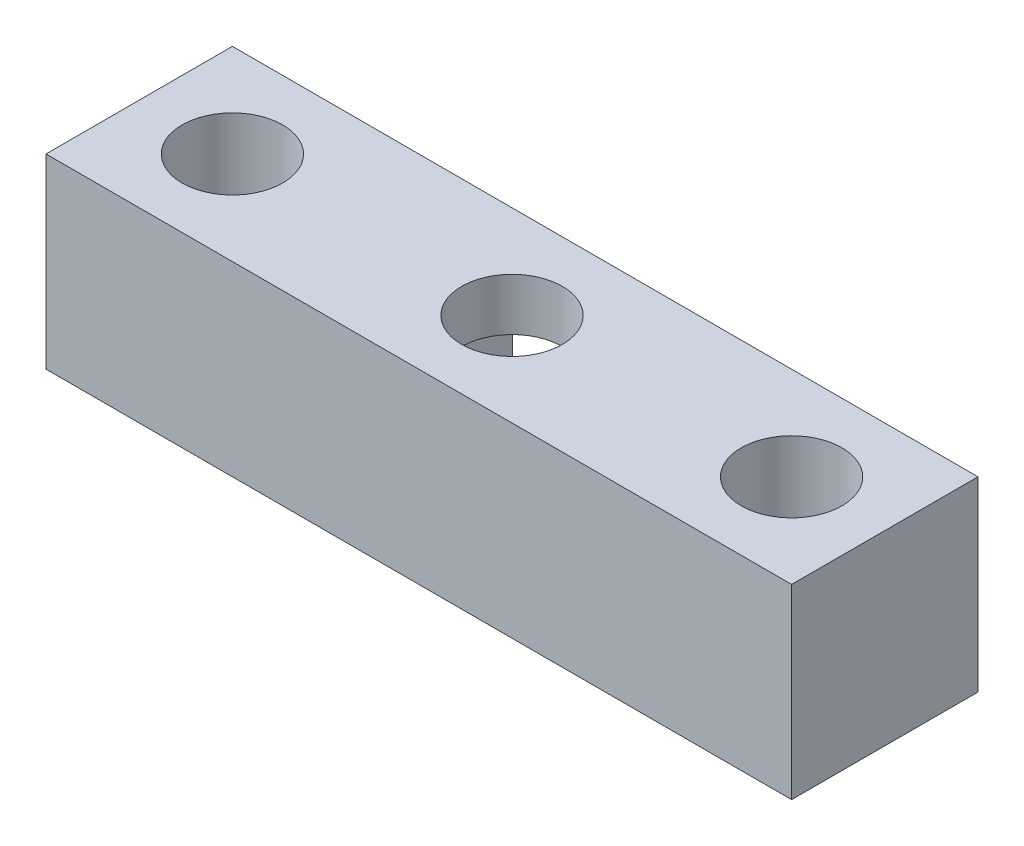
ISO-10303-21;
HEADER;
FILE_DESCRIPTION(('STEP AP214'),'2;1');
FILE_NAME('part.step','',(''),(''),'','','');
FILE_SCHEMA(('AUTOMOTIVE_DESIGN { 1 0 10303 214 1 1 1 1 }'));
ENDSEC;
DATA;
#1=APPLICATION_CONTEXT('core data for automotive mechanical design processes');
#2=APPLICATION_PROTOCOL_DEFINITION('international standard','automotive_design',2000,#1);
#3=PRODUCT_CONTEXT('',#1,'mechanical');
#4=PRODUCT('Part','Part','',(#3));
#5=PRODUCT_RELATED_PRODUCT_CATEGORY('part','',(#4));
#6=PRODUCT_DEFINITION_FORMATION('','',#4);
#7=PRODUCT_DEFINITION_CONTEXT('part definition',#1,'design');
#8=PRODUCT_DEFINITION('design','',#6,#7);
#9=PRODUCT_DEFINITION_SHAPE('','',#8);
#10=(LENGTH_UNIT() NAMED_UNIT(*) SI_UNIT(.MILLI.,.METRE.));
#11=(NAMED_UNIT(*) PLANE_ANGLE_UNIT() SI_UNIT($,.RADIAN.));
#12=(NAMED_UNIT(*) SI_UNIT($,.STERADIAN.) SOLID_ANGLE_UNIT());
#13=UNCERTAINTY_MEASURE_WITH_UNIT(LENGTH_MEASURE(1.E-05),#10,'distance_accuracy_value','');
#14=(GEOMETRIC_REPRESENTATION_CONTEXT(3) GLOBAL_UNCERTAINTY_ASSIGNED_CONTEXT((#13)) GLOBAL_UNIT_ASSIGNED_CONTEXT((#10,
#11,#12)) REPRESENTATION_CONTEXT('',''));
#15=CARTESIAN_POINT('',(0.,0.,0.));
#16=DIRECTION('',(0.,0.,1.));
#17=DIRECTION('',(1.,0.,0.));
#18=AXIS2_PLACEMENT_3D('',#15,#16,#17);
#19=CARTESIAN_POINT('',(-25.4,12.7,-12.7));
#20=DIRECTION('',(0.,0.,1.));
#21=DIRECTION('',(1.,0.,0.));
#22=AXIS2_PLACEMENT_3D('',#19,#20,#21);
#23=PLANE('',#22);
#24=DIRECTION('',(-1.,0.,0.));
#25=VECTOR('',#24,1.);
#26=CARTESIAN_POINT('',(-25.4,0.,-12.7));
#27=LINE('',#26,#25);
#28=CARTESIAN_POINT('',(25.4,0.,-12.7));
#29=VERTEX_POINT('',#28);
#30=CARTESIAN_POINT('',(-25.4,0.,-12.7));
#31=VERTEX_POINT('',#30);
#32=EDGE_CURVE('E79',#29,#31,#27,.T.);
#33=ORIENTED_EDGE('',*,*,#32,.T.);
#34=DIRECTION('',(0.,-1.,0.));
#35=VECTOR('',#34,1.);
#36=CARTESIAN_POINT('',(-25.4,12.7,-12.7));
#37=LINE('',#36,#35);
#38=CARTESIAN_POINT('',(-25.4,12.7,-12.7));
#39=VERTEX_POINT('',#38);
#40=EDGE_CURVE('E199',#39,#31,#37,.T.);
#41=ORIENTED_EDGE('',*,*,#40,.F.);
#42=DIRECTION('',(-1.,0.,0.));
#43=VECTOR('',#42,1.);
#44=CARTESIAN_POINT('',(-25.4,12.7,-12.7));
#45=LINE('',#44,#43);
#46=CARTESIAN_POINT('',(25.4,12.7,-12.7));
#47=VERTEX_POINT('',#46);
#48=EDGE_CURVE('E58',#47,#39,#45,.T.);
#49=ORIENTED_EDGE('',*,*,#48,.F.);
#50=DIRECTION('',(0.,-1.,0.));
#51=VECTOR('',#50,1.);
#52=CARTESIAN_POINT('',(25.4,12.7,-12.7));
#53=LINE('',#52,#51);
#54=EDGE_CURVE('E208',#47,#29,#53,.T.);
#55=ORIENTED_EDGE('',*,*,#54,.T.);
#56=EDGE_LOOP('',(#33,#41,#49,#55));
#57=FACE_BOUND('',#56,.T.);
#58=DIRECTION('',(-1.,0.,0.));
#59=VECTOR('',#58,1.);
#60=CARTESIAN_POINT('',(-25.4,3.556,-12.7));
#61=LINE('',#60,#59);
#62=CARTESIAN_POINT('',(6.30581964008909,3.556,-12.7));
#63=VERTEX_POINT('',#62);
#64=CARTESIAN_POINT('',(-6.30581964008909,3.556,-12.7));
#65=VERTEX_POINT('',#64);
#66=EDGE_CURVE('E172',#63,#65,#61,.T.);
#67=ORIENTED_EDGE('',*,*,#66,.F.);
#68=DIRECTION('',(0.,1.,0.));
#69=VECTOR('',#68,1.);
#70=CARTESIAN_POINT('',(6.30581964008909,12.7,-12.7));
#71=LINE('',#70,#69);
#72=CARTESIAN_POINT('',(6.30581964008909,9.144,-12.7));
#73=VERTEX_POINT('',#72);
#74=EDGE_CURVE('E42',#63,#73,#71,.T.);
#75=ORIENTED_EDGE('',*,*,#74,.T.);
#76=DIRECTION('',(-1.,0.,0.));
#77=VECTOR('',#76,1.);
#78=CARTESIAN_POINT('',(-25.4,9.144,-12.7));
#79=LINE('',#78,#77);
#80=CARTESIAN_POINT('',(-6.30581964008909,9.144,-12.7));
#81=VERTEX_POINT('',#80);
#82=EDGE_CURVE('E168',#73,#81,#79,.T.);
#83=ORIENTED_EDGE('',*,*,#82,.T.);
#84=DIRECTION('',(0.,-1.,0.));
#85=VECTOR('',#84,1.);
#86=CARTESIAN_POINT('',(-6.30581964008909,12.7,-12.7));
#87=LINE('',#86,#85);
#88=EDGE_CURVE('E11',#81,#65,#87,.T.);
#89=ORIENTED_EDGE('',*,*,#88,.T.);
#90=EDGE_LOOP('',(#67,#75,#83,#89));
#91=FACE_BOUND('',#90,.T.);
#92=ADVANCED_FACE('F34',(#57,#91),#23,.F.);
#93=CARTESIAN_POINT('',(0.,0.,-6.34999999999999));
#94=DIRECTION('',(0.,1.,0.));
#95=DIRECTION('',(0.,0.,1.));
#96=AXIS2_PLACEMENT_3D('',#93,#94,#95);
#97=CYLINDRICAL_SURFACE('',#96,3.429);
#98=CARTESIAN_POINT('',(0.,0.,-6.34999999999999));
#99=DIRECTION('',(0.,1.,0.));
#100=DIRECTION('',(0.,0.,1.));
#101=AXIS2_PLACEMENT_3D('',#98,#99,#100);
#102=CIRCLE('',#101,3.429);
#103=CARTESIAN_POINT('',(0.,0.,-2.92099999999999));
#104=VERTEX_POINT('',#103);
#105=EDGE_CURVE('E182',#104,#104,#102,.T.);
#106=ORIENTED_EDGE('',*,*,#105,.F.);
#107=EDGE_LOOP('',(#106));
#108=FACE_BOUND('',#107,.T.);
#109=CARTESIAN_POINT('',(0.,3.556,-6.34999999999999));
#110=DIRECTION('',(0.,1.,0.));
#111=DIRECTION('',(0.,0.,1.));
#112=AXIS2_PLACEMENT_3D('',#109,#110,#111);
#113=CIRCLE('',#112,3.429);
#114=CARTESIAN_POINT('',(0.,3.556,-2.92099999999999));
#115=VERTEX_POINT('',#114);
#116=EDGE_CURVE('E171',#115,#115,#113,.F.);
#117=ORIENTED_EDGE('',*,*,#116,.F.);
#118=EDGE_LOOP('',(#117));
#119=FACE_BOUND('',#118,.T.);
#120=ADVANCED_FACE('F242',(#108,#119),#97,.F.);
#121=CARTESIAN_POINT('',(-25.4,12.7,-12.7));
#122=DIRECTION('',(1.,0.,0.));
#123=DIRECTION('',(0.,0.,-1.));
#124=AXIS2_PLACEMENT_3D('',#121,#122,#123);
#125=PLANE('',#124);
#126=DIRECTION('',(0.,0.,1.));
#127=VECTOR('',#126,1.);
#128=CARTESIAN_POINT('',(-25.4,0.,-12.7));
#129=LINE('',#128,#127);
#130=CARTESIAN_POINT('',(-25.4,0.,0.));
#131=VERTEX_POINT('',#130);
#132=EDGE_CURVE('E190',#31,#131,#129,.T.);
#133=ORIENTED_EDGE('',*,*,#132,.T.);
#134=DIRECTION('',(0.,-1.,0.));
#135=VECTOR('',#134,1.);
#136=CARTESIAN_POINT('',(-25.4,12.7,0.));
#137=LINE('',#136,#135);
#138=CARTESIAN_POINT('',(-25.4,12.7,0.));
#139=VERTEX_POINT('',#138);
#140=EDGE_CURVE('E213',#139,#131,#137,.T.);
#141=ORIENTED_EDGE('',*,*,#140,.F.);
#142=DIRECTION('',(0.,0.,1.));
#143=VECTOR('',#142,1.);
#144=CARTESIAN_POINT('',(-25.4,12.7,-12.7));
#145=LINE('',#144,#143);
#146=EDGE_CURVE('E193',#39,#139,#145,.T.);
#147=ORIENTED_EDGE('',*,*,#146,.F.);
#148=ORIENTED_EDGE('',*,*,#40,.T.);
#149=EDGE_LOOP('',(#133,#141,#147,#148));
#150=FACE_BOUND('',#149,.T.);
#151=ADVANCED_FACE('F36',(#150),#125,.F.);
#152=CARTESIAN_POINT('',(-25.4,12.7,0.));
#153=DIRECTION('',(0.,0.,-1.));
#154=DIRECTION('',(-1.,0.,0.));
#155=AXIS2_PLACEMENT_3D('',#152,#153,#154);
#156=PLANE('',#155);
#157=DIRECTION('',(1.,0.,0.));
#158=VECTOR('',#157,1.);
#159=CARTESIAN_POINT('',(-25.4,0.,0.));
#160=LINE('',#159,#158);
#161=CARTESIAN_POINT('',(25.4,0.,0.));
#162=VERTEX_POINT('',#161);
#163=EDGE_CURVE('E202',#131,#162,#160,.T.);
#164=ORIENTED_EDGE('',*,*,#163,.T.);
#165=DIRECTION('',(0.,-1.,0.));
#166=VECTOR('',#165,1.);
#167=CARTESIAN_POINT('',(25.4,12.7,0.));
#168=LINE('',#167,#166);
#169=CARTESIAN_POINT('',(25.4,12.7,0.));
#170=VERTEX_POINT('',#169);
#171=EDGE_CURVE('E210',#170,#162,#168,.T.);
#172=ORIENTED_EDGE('',*,*,#171,.F.);
#173=DIRECTION('',(1.,0.,0.));
#174=VECTOR('',#173,1.);
#175=CARTESIAN_POINT('',(-25.4,12.7,0.));
#176=LINE('',#175,#174);
#177=EDGE_CURVE('E87',#139,#170,#176,.T.);
#178=ORIENTED_EDGE('',*,*,#177,.F.);
#179=ORIENTED_EDGE('',*,*,#140,.T.);
#180=EDGE_LOOP('',(#164,#172,#178,#179));
#181=FACE_BOUND('',#180,.T.);
#182=ADVANCED_FACE('F257',(#181),#156,.F.);
#183=CARTESIAN_POINT('',(25.4,12.7,-12.7));
#184=DIRECTION('',(-1.,0.,0.));
#185=DIRECTION('',(0.,0.,1.));
#186=AXIS2_PLACEMENT_3D('',#183,#184,#185);
#187=PLANE('',#186);
#188=DIRECTION('',(0.,0.,-1.));
#189=VECTOR('',#188,1.);
#190=CARTESIAN_POINT('',(25.4,0.,-12.7));
#191=LINE('',#190,#189);
#192=EDGE_CURVE('E204',#162,#29,#191,.T.);
#193=ORIENTED_EDGE('',*,*,#192,.T.);
#194=ORIENTED_EDGE('',*,*,#54,.F.);
#195=DIRECTION('',(0.,0.,-1.));
#196=VECTOR('',#195,1.);
#197=CARTESIAN_POINT('',(25.4,12.7,-12.7));
#198=LINE('',#197,#196);
#199=EDGE_CURVE('E196',#170,#47,#198,.T.);
#200=ORIENTED_EDGE('',*,*,#199,.F.);
#201=ORIENTED_EDGE('',*,*,#171,.T.);
#202=EDGE_LOOP('',(#193,#194,#200,#201));
#203=FACE_BOUND('',#202,.T.);
#204=ADVANCED_FACE('F254',(#203),#187,.F.);
#205=CARTESIAN_POINT('',(0.,12.7,0.));
#206=DIRECTION('',(0.,1.,0.));
#207=DIRECTION('',(0.,0.,1.));
#208=AXIS2_PLACEMENT_3D('',#205,#206,#207);
#209=PLANE('',#208);
#210=CARTESIAN_POINT('',(19.05,12.7,-6.34999999999999));
#211=DIRECTION('',(0.,1.,0.));
#212=DIRECTION('',(0.,0.,1.));
#213=AXIS2_PLACEMENT_3D('',#210,#211,#212);
#214=CIRCLE('',#213,3.429);
#215=CARTESIAN_POINT('',(19.05,12.7,-2.92099999999999));
#216=VERTEX_POINT('',#215);
#217=EDGE_CURVE('E179',#216,#216,#214,.T.);
#218=ORIENTED_EDGE('',*,*,#217,.F.);
#219=EDGE_LOOP('',(#218));
#220=FACE_BOUND('',#219,.T.);
#221=CARTESIAN_POINT('',(0.,12.7,-6.34999999999999));
#222=DIRECTION('',(0.,1.,0.));
#223=DIRECTION('',(0.,0.,1.));
#224=AXIS2_PLACEMENT_3D('',#221,#222,#223);
#225=CIRCLE('',#224,3.429);
#226=CARTESIAN_POINT('',(0.,12.7,-2.92099999999999));
#227=VERTEX_POINT('',#226);
#228=EDGE_CURVE('E174',#227,#227,#225,.T.);
#229=ORIENTED_EDGE('',*,*,#228,.F.);
#230=EDGE_LOOP('',(#229));
#231=FACE_BOUND('',#230,.T.);
#232=CARTESIAN_POINT('',(-19.05,12.7,-6.34999999999999));
#233=DIRECTION('',(0.,1.,0.));
#234=DIRECTION('',(0.,0.,1.));
#235=AXIS2_PLACEMENT_3D('',#232,#233,#234);
#236=CIRCLE('',#235,3.429);
#237=CARTESIAN_POINT('',(-19.05,12.7,-2.92099999999999));
#238=VERTEX_POINT('',#237);
#239=EDGE_CURVE('E178',#238,#238,#236,.T.);
#240=ORIENTED_EDGE('',*,*,#239,.F.);
#241=EDGE_LOOP('',(#240));
#242=FACE_BOUND('',#241,.T.);
#243=ORIENTED_EDGE('',*,*,#146,.T.);
#244=ORIENTED_EDGE('',*,*,#177,.T.);
#245=ORIENTED_EDGE('',*,*,#199,.T.);
#246=ORIENTED_EDGE('',*,*,#48,.T.);
#247=EDGE_LOOP('',(#243,#244,#245,#246));
#248=FACE_BOUND('',#247,.T.);
#249=ADVANCED_FACE('F256',(#220,#231,#242,#248),#209,.T.);
#250=CARTESIAN_POINT('',(0.,0.,0.));
#251=DIRECTION('',(0.,1.,0.));
#252=DIRECTION('',(0.,0.,1.));
#253=AXIS2_PLACEMENT_3D('',#250,#251,#252);
#254=PLANE('',#253);
#255=CARTESIAN_POINT('',(19.05,0.,-6.34999999999999));
#256=DIRECTION('',(0.,1.,0.));
#257=DIRECTION('',(0.,0.,1.));
#258=AXIS2_PLACEMENT_3D('',#255,#256,#257);
#259=CIRCLE('',#258,3.429);
#260=CARTESIAN_POINT('',(19.05,0.,-2.92099999999999));
#261=VERTEX_POINT('',#260);
#262=EDGE_CURVE('E175',#261,#261,#259,.T.);
#263=ORIENTED_EDGE('',*,*,#262,.T.);
#264=EDGE_LOOP('',(#263));
#265=FACE_BOUND('',#264,.T.);
#266=ORIENTED_EDGE('',*,*,#105,.T.);
#267=EDGE_LOOP('',(#266));
#268=FACE_BOUND('',#267,.T.);
#269=CARTESIAN_POINT('',(-19.05,0.,-6.34999999999999));
#270=DIRECTION('',(0.,1.,0.));
#271=DIRECTION('',(0.,0.,1.));
#272=AXIS2_PLACEMENT_3D('',#269,#270,#271);
#273=CIRCLE('',#272,3.429);
#274=CARTESIAN_POINT('',(-19.05,0.,-2.92099999999999));
#275=VERTEX_POINT('',#274);
#276=EDGE_CURVE('E187',#275,#275,#273,.T.);
#277=ORIENTED_EDGE('',*,*,#276,.T.);
#278=EDGE_LOOP('',(#277));
#279=FACE_BOUND('',#278,.T.);
#280=ORIENTED_EDGE('',*,*,#132,.F.);
#281=ORIENTED_EDGE('',*,*,#32,.F.);
#282=ORIENTED_EDGE('',*,*,#192,.F.);
#283=ORIENTED_EDGE('',*,*,#163,.F.);
#284=EDGE_LOOP('',(#280,#281,#282,#283));
#285=FACE_BOUND('',#284,.T.);
#286=ADVANCED_FACE('F252',(#265,#268,#279,#285),#254,.F.);
#287=CARTESIAN_POINT('',(-19.05,0.,-6.34999999999999));
#288=DIRECTION('',(0.,1.,0.));
#289=DIRECTION('',(0.,0.,1.));
#290=AXIS2_PLACEMENT_3D('',#287,#288,#289);
#291=CYLINDRICAL_SURFACE('',#290,3.429);
#292=ORIENTED_EDGE('',*,*,#276,.F.);
#293=EDGE_LOOP('',(#292));
#294=FACE_BOUND('',#293,.T.);
#295=ORIENTED_EDGE('',*,*,#239,.T.);
#296=EDGE_LOOP('',(#295));
#297=FACE_BOUND('',#296,.T.);
#298=ADVANCED_FACE('F276',(#294,#297),#291,.F.);
#299=CARTESIAN_POINT('',(0.,9.144,-6.34999999999999));
#300=DIRECTION('',(0.,1.,0.));
#301=DIRECTION('',(0.,0.,1.));
#302=AXIS2_PLACEMENT_3D('',#299,#300,#301);
#303=CIRCLE('',#302,3.429);
#304=CARTESIAN_POINT('',(0.,9.144,-2.92099999999999));
#305=VERTEX_POINT('',#304);
#306=EDGE_CURVE('E164',#305,#305,#303,.F.);
#307=ORIENTED_EDGE('',*,*,#306,.T.);
#308=EDGE_LOOP('',(#307));
#309=FACE_BOUND('',#308,.T.);
#310=ORIENTED_EDGE('',*,*,#228,.T.);
#311=EDGE_LOOP('',(#310));
#312=FACE_BOUND('',#311,.T.);
#313=ADVANCED_FACE('F249',(#309,#312),#97,.F.);
#314=CARTESIAN_POINT('',(19.05,0.,-6.34999999999999));
#315=DIRECTION('',(0.,1.,0.));
#316=DIRECTION('',(0.,0.,1.));
#317=AXIS2_PLACEMENT_3D('',#314,#315,#316);
#318=CYLINDRICAL_SURFACE('',#317,3.429);
#319=ORIENTED_EDGE('',*,*,#262,.F.);
#320=EDGE_LOOP('',(#319));
#321=FACE_BOUND('',#320,.T.);
#322=ORIENTED_EDGE('',*,*,#217,.T.);
#323=EDGE_LOOP('',(#322));
#324=FACE_BOUND('',#323,.T.);
#325=ADVANCED_FACE('F285',(#321,#324),#318,.F.);
#326=CARTESIAN_POINT('',(-6.30581964008909,3.556,-6.34999999999999));
#327=DIRECTION('',(-1.,0.,0.));
#328=DIRECTION('',(0.,0.,1.));
#329=AXIS2_PLACEMENT_3D('',#326,#327,#328);
#330=PLANE('',#329);
#331=DIRECTION('',(0.,0.,1.));
#332=VECTOR('',#331,1.);
#333=CARTESIAN_POINT('',(-6.30581964008909,9.144,-6.34999999999999));
#334=LINE('',#333,#332);
#335=CARTESIAN_POINT('',(-6.30581964008909,9.144,-6.34999999999999));
#336=VERTEX_POINT('',#335);
#337=EDGE_CURVE('E49',#81,#336,#334,.T.);
#338=ORIENTED_EDGE('',*,*,#337,.T.);
#339=DIRECTION('',(0.,1.,0.));
#340=VECTOR('',#339,1.);
#341=CARTESIAN_POINT('',(-6.30581964008909,3.556,-6.34999999999999));
#342=LINE('',#341,#340);
#343=CARTESIAN_POINT('',(-6.30581964008909,3.556,-6.34999999999999));
#344=VERTEX_POINT('',#343);
#345=EDGE_CURVE('E162',#344,#336,#342,.T.);
#346=ORIENTED_EDGE('',*,*,#345,.F.);
#347=DIRECTION('',(0.,0.,1.));
#348=VECTOR('',#347,1.);
#349=CARTESIAN_POINT('',(-6.30581964008909,3.556,-6.34999999999999));
#350=LINE('',#349,#348);
#351=EDGE_CURVE('E132',#65,#344,#350,.T.);
#352=ORIENTED_EDGE('',*,*,#351,.F.);
#353=ORIENTED_EDGE('',*,*,#88,.F.);
#354=EDGE_LOOP('',(#338,#346,#352,#353));
#355=FACE_BOUND('',#354,.T.);
#356=ADVANCED_FACE('F288',(#355),#330,.F.);
#357=CARTESIAN_POINT('',(6.30581964008909,3.556,-19.3961390518567));
#358=DIRECTION('',(1.,0.,0.));
#359=DIRECTION('',(0.,0.,-1.));
#360=AXIS2_PLACEMENT_3D('',#357,#358,#359);
#361=PLANE('',#360);
#362=DIRECTION('',(0.,0.,-1.));
#363=VECTOR('',#362,1.);
#364=CARTESIAN_POINT('',(6.30581964008909,3.556,-19.3961390518567));
#365=LINE('',#364,#363);
#366=CARTESIAN_POINT('',(6.30581964008909,3.556,-6.34999999999999));
#367=VERTEX_POINT('',#366);
#368=EDGE_CURVE('E150',#367,#63,#365,.T.);
#369=ORIENTED_EDGE('',*,*,#368,.F.);
#370=DIRECTION('',(0.,1.,0.));
#371=VECTOR('',#370,1.);
#372=CARTESIAN_POINT('',(6.30581964008909,3.556,-6.34999999999999));
#373=LINE('',#372,#371);
#374=CARTESIAN_POINT('',(6.30581964008909,9.144,-6.34999999999999));
#375=VERTEX_POINT('',#374);
#376=EDGE_CURVE('E165',#367,#375,#373,.T.);
#377=ORIENTED_EDGE('',*,*,#376,.T.);
#378=DIRECTION('',(0.,0.,-1.));
#379=VECTOR('',#378,1.);
#380=CARTESIAN_POINT('',(6.30581964008909,9.144,-19.3961390518567));
#381=LINE('',#380,#379);
#382=EDGE_CURVE('E146',#375,#73,#381,.T.);
#383=ORIENTED_EDGE('',*,*,#382,.T.);
#384=ORIENTED_EDGE('',*,*,#74,.F.);
#385=EDGE_LOOP('',(#369,#377,#383,#384));
#386=FACE_BOUND('',#385,.T.);
#387=ADVANCED_FACE('F223',(#386),#361,.F.);
#388=CARTESIAN_POINT('',(0.,3.556,0.));
#389=DIRECTION('',(0.,1.,0.));
#390=DIRECTION('',(0.,0.,1.));
#391=AXIS2_PLACEMENT_3D('',#388,#389,#390);
#392=PLANE('',#391);
#393=ORIENTED_EDGE('',*,*,#116,.T.);
#394=EDGE_LOOP('',(#393));
#395=FACE_BOUND('',#394,.T.);
#396=ORIENTED_EDGE('',*,*,#66,.T.);
#397=ORIENTED_EDGE('',*,*,#351,.T.);
#398=DIRECTION('',(0.5,0.,0.866025403784439));
#399=VECTOR('',#398,1.);
#400=CARTESIAN_POINT('',(-6.30581964008909,3.556,-6.34999999999999));
#401=LINE('',#400,#399);
#402=CARTESIAN_POINT('',(-3.15290982004455,3.556,-0.888999999999993));
#403=VERTEX_POINT('',#402);
#404=EDGE_CURVE('E126',#344,#403,#401,.T.);
#405=ORIENTED_EDGE('',*,*,#404,.T.);
#406=DIRECTION('',(1.,0.,0.));
#407=VECTOR('',#406,1.);
#408=CARTESIAN_POINT('',(-3.15290982004455,3.556,-0.888999999999993));
#409=LINE('',#408,#407);
#410=CARTESIAN_POINT('',(3.15290982004455,3.556,-0.888999999999993));
#411=VERTEX_POINT('',#410);
#412=EDGE_CURVE('E135',#403,#411,#409,.T.);
#413=ORIENTED_EDGE('',*,*,#412,.T.);
#414=DIRECTION('',(0.5,0.,-0.866025403784439));
#415=VECTOR('',#414,1.);
#416=CARTESIAN_POINT('',(3.15290982004455,3.556,-0.888999999999993));
#417=LINE('',#416,#415);
#418=EDGE_CURVE('E140',#411,#367,#417,.T.);
#419=ORIENTED_EDGE('',*,*,#418,.T.);
#420=ORIENTED_EDGE('',*,*,#368,.T.);
#421=EDGE_LOOP('',(#396,#397,#405,#413,#419,#420));
#422=FACE_BOUND('',#421,.T.);
#423=ADVANCED_FACE('F142',(#395,#422),#392,.T.);
#424=CARTESIAN_POINT('',(0.,9.144,0.));
#425=DIRECTION('',(0.,1.,0.));
#426=DIRECTION('',(0.,0.,1.));
#427=AXIS2_PLACEMENT_3D('',#424,#425,#426);
#428=PLANE('',#427);
#429=ORIENTED_EDGE('',*,*,#306,.F.);
#430=EDGE_LOOP('',(#429));
#431=FACE_BOUND('',#430,.T.);
#432=ORIENTED_EDGE('',*,*,#382,.F.);
#433=DIRECTION('',(0.5,0.,-0.866025403784439));
#434=VECTOR('',#433,1.);
#435=CARTESIAN_POINT('',(3.15290982004455,9.144,-0.888999999999993));
#436=LINE('',#435,#434);
#437=CARTESIAN_POINT('',(3.15290982004455,9.144,-0.888999999999993));
#438=VERTEX_POINT('',#437);
#439=EDGE_CURVE('E157',#438,#375,#436,.T.);
#440=ORIENTED_EDGE('',*,*,#439,.F.);
#441=DIRECTION('',(1.,0.,0.));
#442=VECTOR('',#441,1.);
#443=CARTESIAN_POINT('',(-3.15290982004455,9.144,-0.888999999999993));
#444=LINE('',#443,#442);
#445=CARTESIAN_POINT('',(-3.15290982004455,9.144,-0.888999999999993));
#446=VERTEX_POINT('',#445);
#447=EDGE_CURVE('E155',#446,#438,#444,.T.);
#448=ORIENTED_EDGE('',*,*,#447,.F.);
#449=DIRECTION('',(0.5,0.,0.866025403784439));
#450=VECTOR('',#449,1.);
#451=CARTESIAN_POINT('',(-6.30581964008909,9.144,-6.34999999999999));
#452=LINE('',#451,#450);
#453=EDGE_CURVE('E127',#336,#446,#452,.T.);
#454=ORIENTED_EDGE('',*,*,#453,.F.);
#455=ORIENTED_EDGE('',*,*,#337,.F.);
#456=ORIENTED_EDGE('',*,*,#82,.F.);
#457=EDGE_LOOP('',(#432,#440,#448,#454,#455,#456));
#458=FACE_BOUND('',#457,.T.);
#459=ADVANCED_FACE('F228',(#431,#458),#428,.F.);
#460=CARTESIAN_POINT('',(-6.30581964008909,3.556,-6.34999999999999));
#461=DIRECTION('',(-0.866025403784439,0.,0.5));
#462=DIRECTION('',(0.5,0.,0.866025403784439));
#463=AXIS2_PLACEMENT_3D('',#460,#461,#462);
#464=PLANE('',#463);
#465=ORIENTED_EDGE('',*,*,#453,.T.);
#466=DIRECTION('',(0.,1.,0.));
#467=VECTOR('',#466,1.);
#468=CARTESIAN_POINT('',(-3.15290982004455,3.556,-0.888999999999993));
#469=LINE('',#468,#467);
#470=EDGE_CURVE('E121',#403,#446,#469,.T.);
#471=ORIENTED_EDGE('',*,*,#470,.F.);
#472=ORIENTED_EDGE('',*,*,#404,.F.);
#473=ORIENTED_EDGE('',*,*,#345,.T.);
#474=EDGE_LOOP('',(#465,#471,#472,#473));
#475=FACE_BOUND('',#474,.T.);
#476=ADVANCED_FACE('F123',(#475),#464,.F.);
#477=CARTESIAN_POINT('',(3.15290982004455,3.556,-0.888999999999993));
#478=DIRECTION('',(0.866025403784439,0.,0.5));
#479=DIRECTION('',(0.5,0.,-0.866025403784439));
#480=AXIS2_PLACEMENT_3D('',#477,#478,#479);
#481=PLANE('',#480);
#482=ORIENTED_EDGE('',*,*,#439,.T.);
#483=ORIENTED_EDGE('',*,*,#376,.F.);
#484=ORIENTED_EDGE('',*,*,#418,.F.);
#485=DIRECTION('',(0.,1.,0.));
#486=VECTOR('',#485,1.);
#487=CARTESIAN_POINT('',(3.15290982004455,3.556,-0.888999999999993));
#488=LINE('',#487,#486);
#489=EDGE_CURVE('E131',#411,#438,#488,.T.);
#490=ORIENTED_EDGE('',*,*,#489,.T.);
#491=EDGE_LOOP('',(#482,#483,#484,#490));
#492=FACE_BOUND('',#491,.T.);
#493=ADVANCED_FACE('F226',(#492),#481,.F.);
#494=CARTESIAN_POINT('',(-3.15290982004455,3.556,-0.888999999999993));
#495=DIRECTION('',(0.,0.,1.));
#496=DIRECTION('',(1.,0.,0.));
#497=AXIS2_PLACEMENT_3D('',#494,#495,#496);
#498=PLANE('',#497);
#499=ORIENTED_EDGE('',*,*,#447,.T.);
#500=ORIENTED_EDGE('',*,*,#489,.F.);
#501=ORIENTED_EDGE('',*,*,#412,.F.);
#502=ORIENTED_EDGE('',*,*,#470,.T.);
#503=EDGE_LOOP('',(#499,#500,#501,#502));
#504=FACE_BOUND('',#503,.T.);
#505=ADVANCED_FACE('F136',(#504),#498,.F.);
#506=CLOSED_SHELL('',(#92,#120,#151,#182,#204,#249,#286,#298,#313,#325,#356,#387,#423,#459,#476,
#493,#505));
#507=MANIFOLD_SOLID_BREP('B2',#506);
#508=ADVANCED_BREP_SHAPE_REPRESENTATION('',(#18,#507),#14);
#509=SHAPE_DEFINITION_REPRESENTATION(#9,#508);
ENDSEC;
END-ISO-10303-21;
